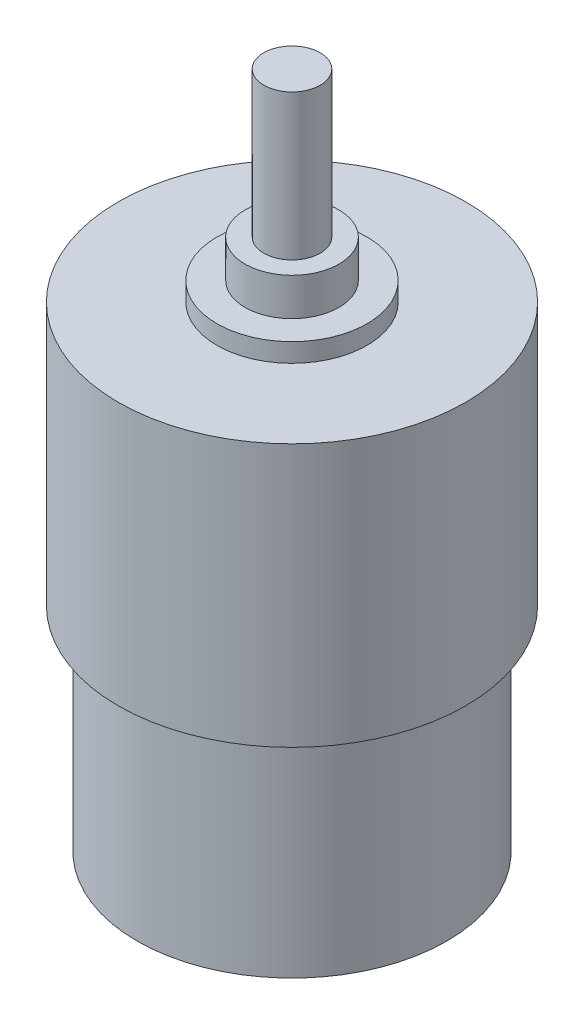
ISO-10303-21;
HEADER;
FILE_DESCRIPTION(('STEP AP214'),'2;1');
FILE_NAME('part.step','',(''),(''),'','','');
FILE_SCHEMA(('AUTOMOTIVE_DESIGN { 1 0 10303 214 1 1 1 1 }'));
ENDSEC;
DATA;
#1=APPLICATION_CONTEXT('core data for automotive mechanical design processes');
#2=APPLICATION_PROTOCOL_DEFINITION('international standard','automotive_design',2000,#1);
#3=PRODUCT_CONTEXT('',#1,'mechanical');
#4=PRODUCT('Part','Part','',(#3));
#5=PRODUCT_RELATED_PRODUCT_CATEGORY('part','',(#4));
#6=PRODUCT_DEFINITION_FORMATION('','',#4);
#7=PRODUCT_DEFINITION_CONTEXT('part definition',#1,'design');
#8=PRODUCT_DEFINITION('design','',#6,#7);
#9=PRODUCT_DEFINITION_SHAPE('','',#8);
#10=(LENGTH_UNIT() NAMED_UNIT(*) SI_UNIT(.MILLI.,.METRE.));
#11=(NAMED_UNIT(*) PLANE_ANGLE_UNIT() SI_UNIT($,.RADIAN.));
#12=(NAMED_UNIT(*) SI_UNIT($,.STERADIAN.) SOLID_ANGLE_UNIT());
#13=UNCERTAINTY_MEASURE_WITH_UNIT(LENGTH_MEASURE(1.E-05),#10,'distance_accuracy_value','');
#14=(GEOMETRIC_REPRESENTATION_CONTEXT(3) GLOBAL_UNCERTAINTY_ASSIGNED_CONTEXT((#13)) GLOBAL_UNIT_ASSIGNED_CONTEXT((#10,
#11,#12)) REPRESENTATION_CONTEXT('',''));
#15=CARTESIAN_POINT('',(0.,0.,0.));
#16=DIRECTION('',(0.,0.,1.));
#17=DIRECTION('',(1.,0.,0.));
#18=AXIS2_PLACEMENT_3D('',#15,#16,#17);
#19=CARTESIAN_POINT('',(0.,0.,0.));
#20=DIRECTION('',(0.,1.,0.));
#21=DIRECTION('',(-1.,0.,0.));
#22=AXIS2_PLACEMENT_3D('',#19,#20,#21);
#23=PLANE('',#22);
#24=CARTESIAN_POINT('',(0.,0.,0.));
#25=DIRECTION('',(0.,1.,0.));
#26=DIRECTION('',(-1.,0.,0.));
#27=AXIS2_PLACEMENT_3D('',#24,#25,#26);
#28=CIRCLE('',#27,16.5);
#29=CARTESIAN_POINT('',(-16.5,0.,0.));
#30=VERTEX_POINT('',#29);
#31=EDGE_CURVE('E10',#30,#30,#28,.T.);
#32=ORIENTED_EDGE('',*,*,#31,.F.);
#33=EDGE_LOOP('',(#32));
#34=FACE_BOUND('',#33,.T.);
#35=ADVANCED_FACE('F35',(#34),#23,.F.);
#36=CARTESIAN_POINT('',(0.,72.2,0.));
#37=DIRECTION('',(0.,1.,0.));
#38=DIRECTION('',(-1.,0.,0.));
#39=AXIS2_PLACEMENT_3D('',#36,#37,#38);
#40=CYLINDRICAL_SURFACE('',#39,16.5);
#41=CARTESIAN_POINT('',(0.,22.7,0.));
#42=DIRECTION('',(0.,1.,0.));
#43=DIRECTION('',(-1.,0.,0.));
#44=AXIS2_PLACEMENT_3D('',#41,#42,#43);
#45=CIRCLE('',#44,16.5);
#46=CARTESIAN_POINT('',(-16.5,22.7,0.));
#47=VERTEX_POINT('',#46);
#48=EDGE_CURVE('E41',#47,#47,#45,.T.);
#49=ORIENTED_EDGE('',*,*,#48,.F.);
#50=EDGE_LOOP('',(#49));
#51=FACE_BOUND('',#50,.T.);
#52=ORIENTED_EDGE('',*,*,#31,.T.);
#53=EDGE_LOOP('',(#52));
#54=FACE_BOUND('',#53,.T.);
#55=ADVANCED_FACE('F119',(#51,#54),#40,.T.);
#56=CARTESIAN_POINT('',(16.5,22.7,0.));
#57=DIRECTION('',(0.,1.,0.));
#58=DIRECTION('',(-1.,0.,0.));
#59=AXIS2_PLACEMENT_3D('',#56,#57,#58);
#60=PLANE('',#59);
#61=CARTESIAN_POINT('',(0.,22.7,0.));
#62=DIRECTION('',(0.,1.,0.));
#63=DIRECTION('',(-1.,0.,0.));
#64=AXIS2_PLACEMENT_3D('',#61,#62,#63);
#65=CIRCLE('',#64,18.5);
#66=CARTESIAN_POINT('',(-18.5,22.7,0.));
#67=VERTEX_POINT('',#66);
#68=EDGE_CURVE('E45',#67,#67,#65,.T.);
#69=ORIENTED_EDGE('',*,*,#68,.F.);
#70=EDGE_LOOP('',(#69));
#71=FACE_BOUND('',#70,.T.);
#72=ORIENTED_EDGE('',*,*,#48,.T.);
#73=EDGE_LOOP('',(#72));
#74=FACE_BOUND('',#73,.T.);
#75=ADVANCED_FACE('F114',(#71,#74),#60,.F.);
#76=CARTESIAN_POINT('',(0.,72.2,0.));
#77=DIRECTION('',(0.,1.,0.));
#78=DIRECTION('',(-1.,0.,0.));
#79=AXIS2_PLACEMENT_3D('',#76,#77,#78);
#80=CYLINDRICAL_SURFACE('',#79,18.5);
#81=CARTESIAN_POINT('',(0.,50.7,0.));
#82=DIRECTION('',(0.,1.,0.));
#83=DIRECTION('',(-1.,0.,0.));
#84=AXIS2_PLACEMENT_3D('',#81,#82,#83);
#85=CIRCLE('',#84,18.5);
#86=CARTESIAN_POINT('',(-18.5,50.7,0.));
#87=VERTEX_POINT('',#86);
#88=EDGE_CURVE('E49',#87,#87,#85,.T.);
#89=ORIENTED_EDGE('',*,*,#88,.F.);
#90=EDGE_LOOP('',(#89));
#91=FACE_BOUND('',#90,.T.);
#92=ORIENTED_EDGE('',*,*,#68,.T.);
#93=EDGE_LOOP('',(#92));
#94=FACE_BOUND('',#93,.T.);
#95=ADVANCED_FACE('F108',(#91,#94),#80,.T.);
#96=CARTESIAN_POINT('',(18.5,50.7,0.));
#97=DIRECTION('',(0.,-1.,0.));
#98=DIRECTION('',(1.,0.,0.));
#99=AXIS2_PLACEMENT_3D('',#96,#97,#98);
#100=PLANE('',#99);
#101=CARTESIAN_POINT('',(0.,50.7,0.));
#102=DIRECTION('',(0.,1.,0.));
#103=DIRECTION('',(-1.,0.,0.));
#104=AXIS2_PLACEMENT_3D('',#101,#102,#103);
#105=CIRCLE('',#104,8.);
#106=CARTESIAN_POINT('',(-8.,50.7,0.));
#107=VERTEX_POINT('',#106);
#108=EDGE_CURVE('E54',#107,#107,#105,.T.);
#109=ORIENTED_EDGE('',*,*,#108,.F.);
#110=EDGE_LOOP('',(#109));
#111=FACE_BOUND('',#110,.T.);
#112=ORIENTED_EDGE('',*,*,#88,.T.);
#113=EDGE_LOOP('',(#112));
#114=FACE_BOUND('',#113,.T.);
#115=ADVANCED_FACE('F102',(#111,#114),#100,.F.);
#116=CARTESIAN_POINT('',(0.,72.2,0.));
#117=DIRECTION('',(0.,1.,0.));
#118=DIRECTION('',(-1.,0.,0.));
#119=AXIS2_PLACEMENT_3D('',#116,#117,#118);
#120=CYLINDRICAL_SURFACE('',#119,8.);
#121=CARTESIAN_POINT('',(0.,52.7,0.));
#122=DIRECTION('',(0.,1.,0.));
#123=DIRECTION('',(-1.,0.,0.));
#124=AXIS2_PLACEMENT_3D('',#121,#122,#123);
#125=CIRCLE('',#124,8.);
#126=CARTESIAN_POINT('',(-8.,52.7,0.));
#127=VERTEX_POINT('',#126);
#128=EDGE_CURVE('E57',#127,#127,#125,.T.);
#129=ORIENTED_EDGE('',*,*,#128,.F.);
#130=EDGE_LOOP('',(#129));
#131=FACE_BOUND('',#130,.T.);
#132=ORIENTED_EDGE('',*,*,#108,.T.);
#133=EDGE_LOOP('',(#132));
#134=FACE_BOUND('',#133,.T.);
#135=ADVANCED_FACE('F96',(#131,#134),#120,.T.);
#136=CARTESIAN_POINT('',(8.,52.7,0.));
#137=DIRECTION('',(0.,-1.,0.));
#138=DIRECTION('',(1.,0.,0.));
#139=AXIS2_PLACEMENT_3D('',#136,#137,#138);
#140=PLANE('',#139);
#141=CARTESIAN_POINT('',(0.,52.7,0.));
#142=DIRECTION('',(0.,1.,0.));
#143=DIRECTION('',(-1.,0.,0.));
#144=AXIS2_PLACEMENT_3D('',#141,#142,#143);
#145=CIRCLE('',#144,5.);
#146=CARTESIAN_POINT('',(-5.,52.7,0.));
#147=VERTEX_POINT('',#146);
#148=EDGE_CURVE('E60',#147,#147,#145,.T.);
#149=ORIENTED_EDGE('',*,*,#148,.F.);
#150=EDGE_LOOP('',(#149));
#151=FACE_BOUND('',#150,.T.);
#152=ORIENTED_EDGE('',*,*,#128,.T.);
#153=EDGE_LOOP('',(#152));
#154=FACE_BOUND('',#153,.T.);
#155=ADVANCED_FACE('F90',(#151,#154),#140,.F.);
#156=CARTESIAN_POINT('',(0.,72.2,0.));
#157=DIRECTION('',(0.,1.,0.));
#158=DIRECTION('',(-1.,0.,0.));
#159=AXIS2_PLACEMENT_3D('',#156,#157,#158);
#160=CYLINDRICAL_SURFACE('',#159,5.);
#161=CARTESIAN_POINT('',(0.,56.7,0.));
#162=DIRECTION('',(0.,1.,0.));
#163=DIRECTION('',(-1.,0.,0.));
#164=AXIS2_PLACEMENT_3D('',#161,#162,#163);
#165=CIRCLE('',#164,5.);
#166=CARTESIAN_POINT('',(-5.,56.7,0.));
#167=VERTEX_POINT('',#166);
#168=EDGE_CURVE('E63',#167,#167,#165,.T.);
#169=ORIENTED_EDGE('',*,*,#168,.F.);
#170=EDGE_LOOP('',(#169));
#171=FACE_BOUND('',#170,.T.);
#172=ORIENTED_EDGE('',*,*,#148,.T.);
#173=EDGE_LOOP('',(#172));
#174=FACE_BOUND('',#173,.T.);
#175=ADVANCED_FACE('F84',(#171,#174),#160,.T.);
#176=CARTESIAN_POINT('',(5.,56.7,0.));
#177=DIRECTION('',(0.,-1.,0.));
#178=DIRECTION('',(1.,0.,0.));
#179=AXIS2_PLACEMENT_3D('',#176,#177,#178);
#180=PLANE('',#179);
#181=CARTESIAN_POINT('',(0.,56.7,0.));
#182=DIRECTION('',(0.,1.,0.));
#183=DIRECTION('',(-1.,0.,0.));
#184=AXIS2_PLACEMENT_3D('',#181,#182,#183);
#185=CIRCLE('',#184,3.);
#186=CARTESIAN_POINT('',(-3.,56.7,0.));
#187=VERTEX_POINT('',#186);
#188=EDGE_CURVE('E66',#187,#187,#185,.T.);
#189=ORIENTED_EDGE('',*,*,#188,.F.);
#190=EDGE_LOOP('',(#189));
#191=FACE_BOUND('',#190,.T.);
#192=ORIENTED_EDGE('',*,*,#168,.T.);
#193=EDGE_LOOP('',(#192));
#194=FACE_BOUND('',#193,.T.);
#195=ADVANCED_FACE('F78',(#191,#194),#180,.F.);
#196=CARTESIAN_POINT('',(0.,72.2,0.));
#197=DIRECTION('',(0.,1.,0.));
#198=DIRECTION('',(-1.,0.,0.));
#199=AXIS2_PLACEMENT_3D('',#196,#197,#198);
#200=CYLINDRICAL_SURFACE('',#199,3.);
#201=CARTESIAN_POINT('',(0.,72.2,0.));
#202=DIRECTION('',(0.,1.,0.));
#203=DIRECTION('',(-1.,0.,0.));
#204=AXIS2_PLACEMENT_3D('',#201,#202,#203);
#205=CIRCLE('',#204,3.);
#206=CARTESIAN_POINT('',(-3.,72.2,0.));
#207=VERTEX_POINT('',#206);
#208=EDGE_CURVE('E69',#207,#207,#205,.T.);
#209=ORIENTED_EDGE('',*,*,#208,.F.);
#210=EDGE_LOOP('',(#209));
#211=FACE_BOUND('',#210,.T.);
#212=ORIENTED_EDGE('',*,*,#188,.T.);
#213=EDGE_LOOP('',(#212));
#214=FACE_BOUND('',#213,.T.);
#215=ADVANCED_FACE('F75',(#211,#214),#200,.T.);
#216=CARTESIAN_POINT('',(0.,72.2,0.));
#217=DIRECTION('',(0.,-1.,0.));
#218=DIRECTION('',(1.,0.,0.));
#219=AXIS2_PLACEMENT_3D('',#216,#217,#218);
#220=PLANE('',#219);
#221=ORIENTED_EDGE('',*,*,#208,.T.);
#222=EDGE_LOOP('',(#221));
#223=FACE_BOUND('',#222,.T.);
#224=ADVANCED_FACE('F73',(#223),#220,.F.);
#225=CLOSED_SHELL('',(#35,#55,#75,#95,#115,#135,#155,#175,#195,#215,#224));
#226=MANIFOLD_SOLID_BREP('B2',#225);
#227=ADVANCED_BREP_SHAPE_REPRESENTATION('',(#18,#226),#14);
#228=SHAPE_DEFINITION_REPRESENTATION(#9,#227);
ENDSEC;
END-ISO-10303-21;
